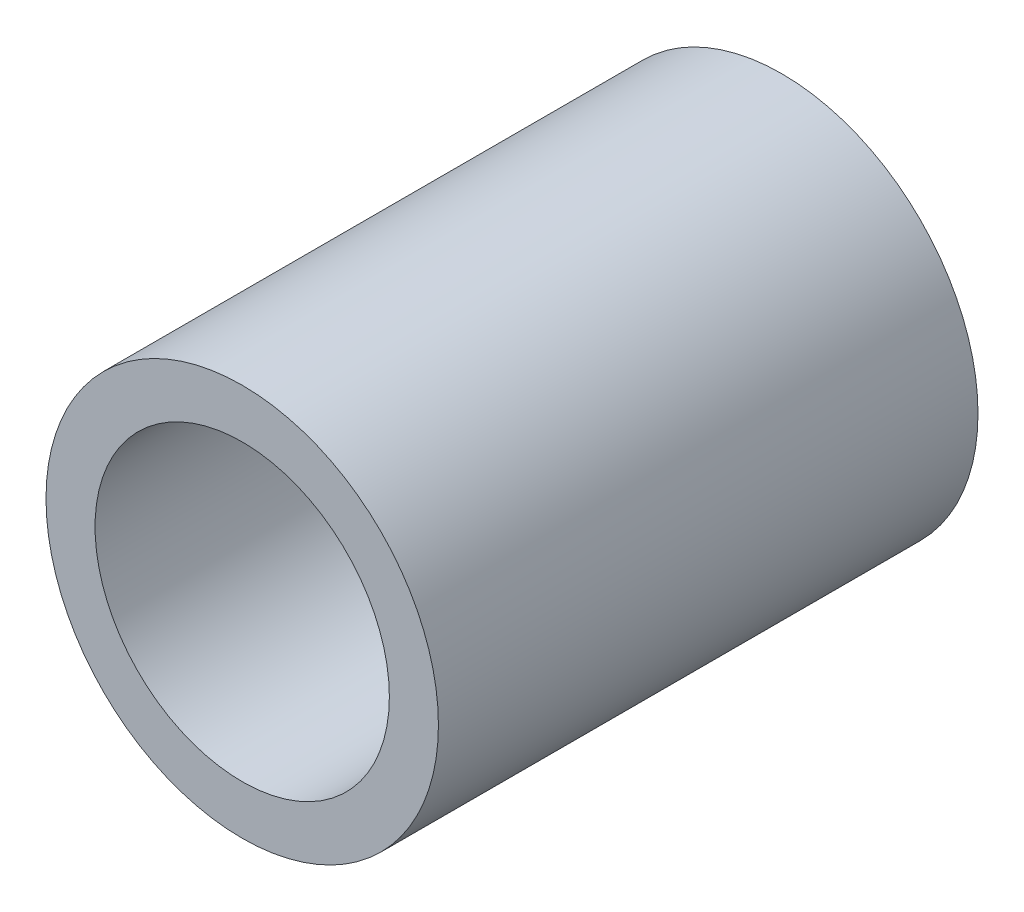
ISO-10303-21;
HEADER;
FILE_DESCRIPTION(('STEP AP214'),'2;1');
FILE_NAME('part.step','',(''),(''),'','','');
FILE_SCHEMA(('AUTOMOTIVE_DESIGN { 1 0 10303 214 1 1 1 1 }'));
ENDSEC;
DATA;
#1=APPLICATION_CONTEXT('core data for automotive mechanical design processes');
#2=APPLICATION_PROTOCOL_DEFINITION('international standard','automotive_design',2000,#1);
#3=PRODUCT_CONTEXT('',#1,'mechanical');
#4=PRODUCT('Part','Part','',(#3));
#5=PRODUCT_RELATED_PRODUCT_CATEGORY('part','',(#4));
#6=PRODUCT_DEFINITION_FORMATION('','',#4);
#7=PRODUCT_DEFINITION_CONTEXT('part definition',#1,'design');
#8=PRODUCT_DEFINITION('design','',#6,#7);
#9=PRODUCT_DEFINITION_SHAPE('','',#8);
#10=(LENGTH_UNIT() NAMED_UNIT(*) SI_UNIT(.MILLI.,.METRE.));
#11=(NAMED_UNIT(*) PLANE_ANGLE_UNIT() SI_UNIT($,.RADIAN.));
#12=(NAMED_UNIT(*) SI_UNIT($,.STERADIAN.) SOLID_ANGLE_UNIT());
#13=UNCERTAINTY_MEASURE_WITH_UNIT(LENGTH_MEASURE(1.E-05),#10,'distance_accuracy_value','');
#14=(GEOMETRIC_REPRESENTATION_CONTEXT(3) GLOBAL_UNCERTAINTY_ASSIGNED_CONTEXT((#13)) GLOBAL_UNIT_ASSIGNED_CONTEXT((#10,
#11,#12)) REPRESENTATION_CONTEXT('',''));
#15=CARTESIAN_POINT('',(0.,0.,0.));
#16=DIRECTION('',(0.,0.,1.));
#17=DIRECTION('',(1.,0.,0.));
#18=AXIS2_PLACEMENT_3D('',#15,#16,#17);
#19=CARTESIAN_POINT('',(0.,0.,110.));
#20=DIRECTION('',(0.,0.,1.));
#21=DIRECTION('',(1.,0.,0.));
#22=AXIS2_PLACEMENT_3D('',#19,#20,#21);
#23=PLANE('',#22);
#24=CARTESIAN_POINT('',(0.,0.,110.));
#25=DIRECTION('',(0.,0.,1.));
#26=DIRECTION('',(1.,0.,0.));
#27=AXIS2_PLACEMENT_3D('',#24,#25,#26);
#28=CIRCLE('',#27,40.);
#29=CARTESIAN_POINT('',(40.,0.,110.));
#30=VERTEX_POINT('',#29);
#31=EDGE_CURVE('E10',#30,#30,#28,.T.);
#32=ORIENTED_EDGE('',*,*,#31,.T.);
#33=EDGE_LOOP('',(#32));
#34=FACE_BOUND('',#33,.T.);
#35=CARTESIAN_POINT('',(0.,0.,110.));
#36=DIRECTION('',(0.,0.,1.));
#37=DIRECTION('',(1.,0.,0.));
#38=AXIS2_PLACEMENT_3D('',#35,#36,#37);
#39=CIRCLE('',#38,30.);
#40=CARTESIAN_POINT('',(30.,0.,110.));
#41=VERTEX_POINT('',#40);
#42=EDGE_CURVE('E41',#41,#41,#39,.T.);
#43=ORIENTED_EDGE('',*,*,#42,.F.);
#44=EDGE_LOOP('',(#43));
#45=FACE_BOUND('',#44,.T.);
#46=ADVANCED_FACE('F30',(#34,#45),#23,.T.);
#47=CARTESIAN_POINT('',(0.,0.,0.));
#48=DIRECTION('',(0.,0.,1.));
#49=DIRECTION('',(1.,0.,0.));
#50=AXIS2_PLACEMENT_3D('',#47,#48,#49);
#51=PLANE('',#50);
#52=CARTESIAN_POINT('',(0.,0.,0.));
#53=DIRECTION('',(0.,0.,1.));
#54=DIRECTION('',(1.,0.,0.));
#55=AXIS2_PLACEMENT_3D('',#52,#53,#54);
#56=CIRCLE('',#55,40.);
#57=CARTESIAN_POINT('',(40.,0.,0.));
#58=VERTEX_POINT('',#57);
#59=EDGE_CURVE('E34',#58,#58,#56,.T.);
#60=ORIENTED_EDGE('',*,*,#59,.F.);
#61=EDGE_LOOP('',(#60));
#62=FACE_BOUND('',#61,.T.);
#63=CARTESIAN_POINT('',(0.,0.,0.));
#64=DIRECTION('',(0.,0.,1.));
#65=DIRECTION('',(1.,0.,0.));
#66=AXIS2_PLACEMENT_3D('',#63,#64,#65);
#67=CIRCLE('',#66,30.);
#68=CARTESIAN_POINT('',(30.,0.,0.));
#69=VERTEX_POINT('',#68);
#70=EDGE_CURVE('E43',#69,#69,#67,.T.);
#71=ORIENTED_EDGE('',*,*,#70,.T.);
#72=EDGE_LOOP('',(#71));
#73=FACE_BOUND('',#72,.T.);
#74=ADVANCED_FACE('F53',(#62,#73),#51,.F.);
#75=CARTESIAN_POINT('',(0.,0.,110.));
#76=DIRECTION('',(0.,0.,-1.));
#77=DIRECTION('',(-1.,0.,0.));
#78=AXIS2_PLACEMENT_3D('',#75,#76,#77);
#79=CYLINDRICAL_SURFACE('',#78,40.);
#80=ORIENTED_EDGE('',*,*,#31,.F.);
#81=EDGE_LOOP('',(#80));
#82=FACE_BOUND('',#81,.T.);
#83=ORIENTED_EDGE('',*,*,#59,.T.);
#84=EDGE_LOOP('',(#83));
#85=FACE_BOUND('',#84,.T.);
#86=ADVANCED_FACE('F32',(#82,#85),#79,.T.);
#87=CARTESIAN_POINT('',(0.,0.,110.));
#88=DIRECTION('',(0.,0.,-1.));
#89=DIRECTION('',(-1.,0.,0.));
#90=AXIS2_PLACEMENT_3D('',#87,#88,#89);
#91=CYLINDRICAL_SURFACE('',#90,30.);
#92=ORIENTED_EDGE('',*,*,#42,.T.);
#93=EDGE_LOOP('',(#92));
#94=FACE_BOUND('',#93,.T.);
#95=ORIENTED_EDGE('',*,*,#70,.F.);
#96=EDGE_LOOP('',(#95));
#97=FACE_BOUND('',#96,.T.);
#98=ADVANCED_FACE('F49',(#94,#97),#91,.F.);
#99=CLOSED_SHELL('',(#46,#74,#86,#98));
#100=MANIFOLD_SOLID_BREP('B2',#99);
#101=ADVANCED_BREP_SHAPE_REPRESENTATION('',(#18,#100),#14);
#102=SHAPE_DEFINITION_REPRESENTATION(#9,#101);
ENDSEC;
END-ISO-10303-21;
